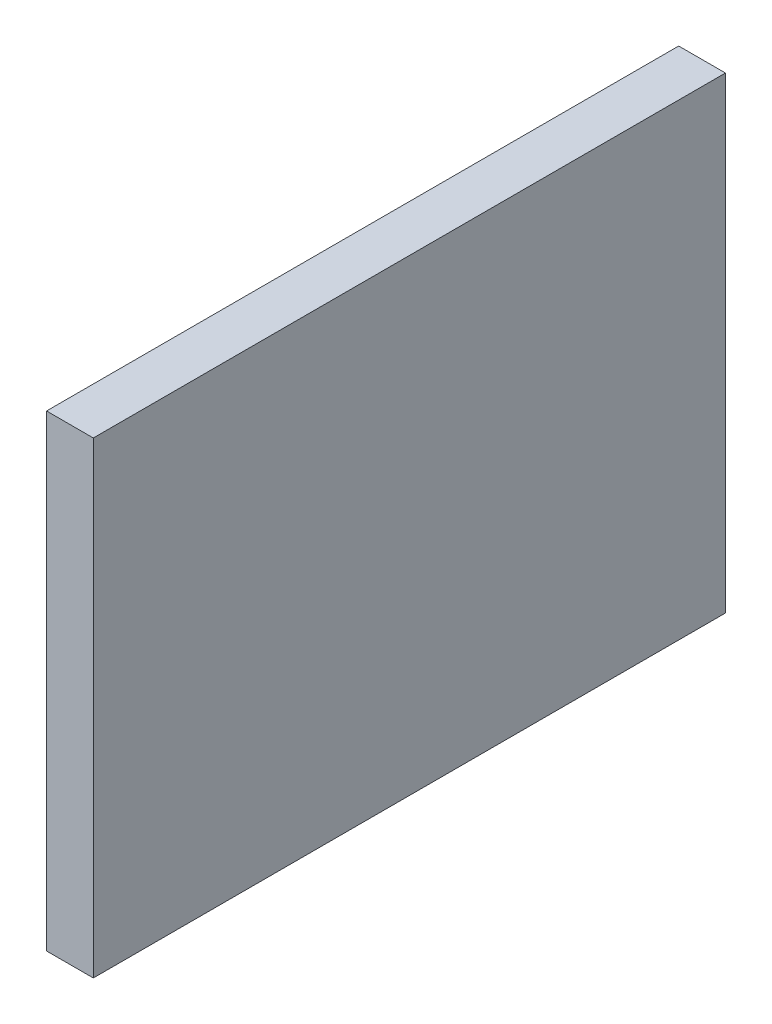
ISO-10303-21;
HEADER;
FILE_DESCRIPTION(('STEP AP214'),'2;1');
FILE_NAME('part.step','',(''),(''),'','','');
FILE_SCHEMA(('AUTOMOTIVE_DESIGN { 1 0 10303 214 1 1 1 1 }'));
ENDSEC;
DATA;
#1=APPLICATION_CONTEXT('core data for automotive mechanical design processes');
#2=APPLICATION_PROTOCOL_DEFINITION('international standard','automotive_design',2000,#1);
#3=PRODUCT_CONTEXT('',#1,'mechanical');
#4=PRODUCT('Part','Part','',(#3));
#5=PRODUCT_RELATED_PRODUCT_CATEGORY('part','',(#4));
#6=PRODUCT_DEFINITION_FORMATION('','',#4);
#7=PRODUCT_DEFINITION_CONTEXT('part definition',#1,'design');
#8=PRODUCT_DEFINITION('design','',#6,#7);
#9=PRODUCT_DEFINITION_SHAPE('','',#8);
#10=(LENGTH_UNIT() NAMED_UNIT(*) SI_UNIT(.MILLI.,.METRE.));
#11=(NAMED_UNIT(*) PLANE_ANGLE_UNIT() SI_UNIT($,.RADIAN.));
#12=(NAMED_UNIT(*) SI_UNIT($,.STERADIAN.) SOLID_ANGLE_UNIT());
#13=UNCERTAINTY_MEASURE_WITH_UNIT(LENGTH_MEASURE(1.E-05),#10,'distance_accuracy_value','');
#14=(GEOMETRIC_REPRESENTATION_CONTEXT(3) GLOBAL_UNCERTAINTY_ASSIGNED_CONTEXT((#13)) GLOBAL_UNIT_ASSIGNED_CONTEXT((#10,
#11,#12)) REPRESENTATION_CONTEXT('',''));
#15=CARTESIAN_POINT('',(0.,0.,0.));
#16=DIRECTION('',(0.,0.,1.));
#17=DIRECTION('',(1.,0.,0.));
#18=AXIS2_PLACEMENT_3D('',#15,#16,#17);
#19=CARTESIAN_POINT('',(3.,0.,0.));
#20=DIRECTION('',(0.,0.,-1.));
#21=DIRECTION('',(-1.,0.,0.));
#22=AXIS2_PLACEMENT_3D('',#19,#20,#21);
#23=PLANE('',#22);
#24=DIRECTION('',(0.,-1.,0.));
#25=VECTOR('',#24,1.);
#26=CARTESIAN_POINT('',(0.,0.,0.));
#27=LINE('',#26,#25);
#28=CARTESIAN_POINT('',(0.,30.,0.));
#29=VERTEX_POINT('',#28);
#30=CARTESIAN_POINT('',(0.,0.,0.));
#31=VERTEX_POINT('',#30);
#32=EDGE_CURVE('E100',#29,#31,#27,.T.);
#33=ORIENTED_EDGE('',*,*,#32,.T.);
#34=DIRECTION('',(-1.,0.,0.));
#35=VECTOR('',#34,1.);
#36=CARTESIAN_POINT('',(3.,0.,0.));
#37=LINE('',#36,#35);
#38=CARTESIAN_POINT('',(3.,0.,0.));
#39=VERTEX_POINT('',#38);
#40=EDGE_CURVE('E11',#39,#31,#37,.T.);
#41=ORIENTED_EDGE('',*,*,#40,.F.);
#42=DIRECTION('',(0.,-1.,0.));
#43=VECTOR('',#42,1.);
#44=CARTESIAN_POINT('',(3.,0.,0.));
#45=LINE('',#44,#43);
#46=CARTESIAN_POINT('',(3.,30.,0.));
#47=VERTEX_POINT('',#46);
#48=EDGE_CURVE('E88',#47,#39,#45,.T.);
#49=ORIENTED_EDGE('',*,*,#48,.F.);
#50=DIRECTION('',(-1.,0.,0.));
#51=VECTOR('',#50,1.);
#52=CARTESIAN_POINT('',(3.,30.,0.));
#53=LINE('',#52,#51);
#54=EDGE_CURVE('E96',#47,#29,#53,.T.);
#55=ORIENTED_EDGE('',*,*,#54,.T.);
#56=EDGE_LOOP('',(#33,#41,#49,#55));
#57=FACE_BOUND('',#56,.T.);
#58=ADVANCED_FACE('F37',(#57),#23,.F.);
#59=CARTESIAN_POINT('',(3.,0.,0.));
#60=DIRECTION('',(0.,1.,0.));
#61=DIRECTION('',(0.,0.,1.));
#62=AXIS2_PLACEMENT_3D('',#59,#60,#61);
#63=PLANE('',#62);
#64=DIRECTION('',(0.,0.,-1.));
#65=VECTOR('',#64,1.);
#66=CARTESIAN_POINT('',(0.,0.,0.));
#67=LINE('',#66,#65);
#68=CARTESIAN_POINT('',(0.,0.,-40.55));
#69=VERTEX_POINT('',#68);
#70=EDGE_CURVE('E92',#31,#69,#67,.T.);
#71=ORIENTED_EDGE('',*,*,#70,.T.);
#72=DIRECTION('',(-1.,0.,0.));
#73=VECTOR('',#72,1.);
#74=CARTESIAN_POINT('',(3.,0.,-40.55));
#75=LINE('',#74,#73);
#76=CARTESIAN_POINT('',(3.,0.,-40.55));
#77=VERTEX_POINT('',#76);
#78=EDGE_CURVE('E45',#77,#69,#75,.T.);
#79=ORIENTED_EDGE('',*,*,#78,.F.);
#80=DIRECTION('',(0.,0.,-1.));
#81=VECTOR('',#80,1.);
#82=CARTESIAN_POINT('',(3.,0.,0.));
#83=LINE('',#82,#81);
#84=EDGE_CURVE('E83',#39,#77,#83,.T.);
#85=ORIENTED_EDGE('',*,*,#84,.F.);
#86=ORIENTED_EDGE('',*,*,#40,.T.);
#87=EDGE_LOOP('',(#71,#79,#85,#86));
#88=FACE_BOUND('',#87,.T.);
#89=ADVANCED_FACE('F91',(#88),#63,.F.);
#90=CARTESIAN_POINT('',(3.,0.,-40.55));
#91=DIRECTION('',(0.,0.,1.));
#92=DIRECTION('',(0.,-1.,0.));
#93=AXIS2_PLACEMENT_3D('',#90,#91,#92);
#94=PLANE('',#93);
#95=DIRECTION('',(0.,1.,0.));
#96=VECTOR('',#95,1.);
#97=CARTESIAN_POINT('',(0.,0.,-40.55));
#98=LINE('',#97,#96);
#99=CARTESIAN_POINT('',(0.,30.,-40.55));
#100=VERTEX_POINT('',#99);
#101=EDGE_CURVE('E70',#69,#100,#98,.T.);
#102=ORIENTED_EDGE('',*,*,#101,.T.);
#103=DIRECTION('',(-1.,0.,0.));
#104=VECTOR('',#103,1.);
#105=CARTESIAN_POINT('',(3.,30.,-40.55));
#106=LINE('',#105,#104);
#107=CARTESIAN_POINT('',(3.,30.,-40.55));
#108=VERTEX_POINT('',#107);
#109=EDGE_CURVE('E93',#108,#100,#106,.T.);
#110=ORIENTED_EDGE('',*,*,#109,.F.);
#111=DIRECTION('',(0.,1.,0.));
#112=VECTOR('',#111,1.);
#113=CARTESIAN_POINT('',(3.,0.,-40.55));
#114=LINE('',#113,#112);
#115=EDGE_CURVE('E86',#77,#108,#114,.T.);
#116=ORIENTED_EDGE('',*,*,#115,.F.);
#117=ORIENTED_EDGE('',*,*,#78,.T.);
#118=EDGE_LOOP('',(#102,#110,#116,#117));
#119=FACE_BOUND('',#118,.T.);
#120=ADVANCED_FACE('F94',(#119),#94,.F.);
#121=CARTESIAN_POINT('',(3.,30.,0.));
#122=DIRECTION('',(0.,-1.,0.));
#123=DIRECTION('',(0.,0.,-1.));
#124=AXIS2_PLACEMENT_3D('',#121,#122,#123);
#125=PLANE('',#124);
#126=DIRECTION('',(0.,0.,1.));
#127=VECTOR('',#126,1.);
#128=CARTESIAN_POINT('',(0.,30.,0.));
#129=LINE('',#128,#127);
#130=EDGE_CURVE('E76',#100,#29,#129,.T.);
#131=ORIENTED_EDGE('',*,*,#130,.T.);
#132=ORIENTED_EDGE('',*,*,#54,.F.);
#133=DIRECTION('',(0.,0.,1.));
#134=VECTOR('',#133,1.);
#135=CARTESIAN_POINT('',(3.,30.,0.));
#136=LINE('',#135,#134);
#137=EDGE_CURVE('E53',#108,#47,#136,.T.);
#138=ORIENTED_EDGE('',*,*,#137,.F.);
#139=ORIENTED_EDGE('',*,*,#109,.T.);
#140=EDGE_LOOP('',(#131,#132,#138,#139));
#141=FACE_BOUND('',#140,.T.);
#142=ADVANCED_FACE('F107',(#141),#125,.F.);
#143=CARTESIAN_POINT('',(3.,0.,0.));
#144=DIRECTION('',(-1.,0.,0.));
#145=DIRECTION('',(0.,0.,1.));
#146=AXIS2_PLACEMENT_3D('',#143,#144,#145);
#147=PLANE('',#146);
#148=ORIENTED_EDGE('',*,*,#48,.T.);
#149=ORIENTED_EDGE('',*,*,#84,.T.);
#150=ORIENTED_EDGE('',*,*,#115,.T.);
#151=ORIENTED_EDGE('',*,*,#137,.T.);
#152=EDGE_LOOP('',(#148,#149,#150,#151));
#153=FACE_BOUND('',#152,.T.);
#154=ADVANCED_FACE('F84',(#153),#147,.F.);
#155=CARTESIAN_POINT('',(0.,0.,0.));
#156=DIRECTION('',(-1.,0.,0.));
#157=DIRECTION('',(0.,0.,1.));
#158=AXIS2_PLACEMENT_3D('',#155,#156,#157);
#159=PLANE('',#158);
#160=ORIENTED_EDGE('',*,*,#32,.F.);
#161=ORIENTED_EDGE('',*,*,#130,.F.);
#162=ORIENTED_EDGE('',*,*,#101,.F.);
#163=ORIENTED_EDGE('',*,*,#70,.F.);
#164=EDGE_LOOP('',(#160,#161,#162,#163));
#165=FACE_BOUND('',#164,.T.);
#166=ADVANCED_FACE('F110',(#165),#159,.T.);
#167=CLOSED_SHELL('',(#58,#89,#120,#142,#154,#166));
#168=MANIFOLD_SOLID_BREP('B2',#167);
#169=ADVANCED_BREP_SHAPE_REPRESENTATION('',(#18,#168),#14);
#170=SHAPE_DEFINITION_REPRESENTATION(#9,#169);
ENDSEC;
END-ISO-10303-21;
